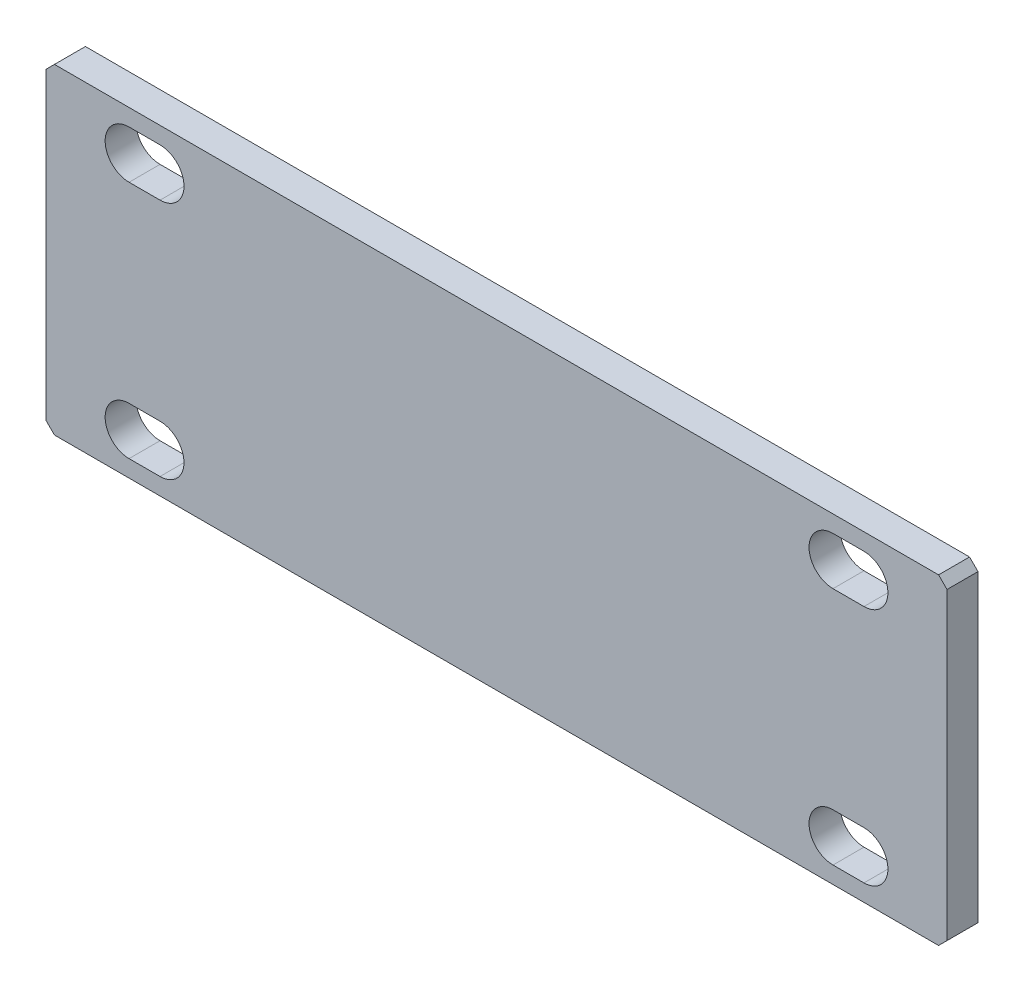
ISO-10303-21;
HEADER;
FILE_DESCRIPTION(('STEP AP214'),'2;1');
FILE_NAME('part.step','',(''),(''),'','','');
FILE_SCHEMA(('AUTOMOTIVE_DESIGN { 1 0 10303 214 1 1 1 1 }'));
ENDSEC;
DATA;
#1=APPLICATION_CONTEXT('core data for automotive mechanical design processes');
#2=APPLICATION_PROTOCOL_DEFINITION('international standard','automotive_design',2000,#1);
#3=PRODUCT_CONTEXT('',#1,'mechanical');
#4=PRODUCT('Part','Part','',(#3));
#5=PRODUCT_RELATED_PRODUCT_CATEGORY('part','',(#4));
#6=PRODUCT_DEFINITION_FORMATION('','',#4);
#7=PRODUCT_DEFINITION_CONTEXT('part definition',#1,'design');
#8=PRODUCT_DEFINITION('design','',#6,#7);
#9=PRODUCT_DEFINITION_SHAPE('','',#8);
#10=(LENGTH_UNIT() NAMED_UNIT(*) SI_UNIT(.MILLI.,.METRE.));
#11=(NAMED_UNIT(*) PLANE_ANGLE_UNIT() SI_UNIT($,.RADIAN.));
#12=(NAMED_UNIT(*) SI_UNIT($,.STERADIAN.) SOLID_ANGLE_UNIT());
#13=UNCERTAINTY_MEASURE_WITH_UNIT(LENGTH_MEASURE(1.E-05),#10,'distance_accuracy_value','');
#14=(GEOMETRIC_REPRESENTATION_CONTEXT(3) GLOBAL_UNCERTAINTY_ASSIGNED_CONTEXT((#13)) GLOBAL_UNIT_ASSIGNED_CONTEXT((#10,
#11,#12)) REPRESENTATION_CONTEXT('',''));
#15=CARTESIAN_POINT('',(0.,0.,0.));
#16=DIRECTION('',(0.,0.,1.));
#17=DIRECTION('',(1.,0.,0.));
#18=AXIS2_PLACEMENT_3D('',#15,#16,#17);
#19=CARTESIAN_POINT('',(0.,0.,2.2));
#20=DIRECTION('',(0.,0.,1.));
#21=DIRECTION('',(1.,0.,0.));
#22=AXIS2_PLACEMENT_3D('',#19,#20,#21);
#23=PLANE('',#22);
#24=DIRECTION('',(0.70710678118655,-0.707106781186546,0.));
#25=VECTOR('',#24,1.);
#26=CARTESIAN_POINT('',(-32.,-10.8,2.2));
#27=LINE('',#26,#25);
#28=CARTESIAN_POINT('',(-32.,-10.8,2.2));
#29=VERTEX_POINT('',#28);
#30=CARTESIAN_POINT('',(-31.4,-11.4,2.2));
#31=VERTEX_POINT('',#30);
#32=EDGE_CURVE('E333',#29,#31,#27,.T.);
#33=ORIENTED_EDGE('',*,*,#32,.T.);
#34=DIRECTION('',(1.,0.,0.));
#35=VECTOR('',#34,1.);
#36=CARTESIAN_POINT('',(-31.4,-11.4,2.2));
#37=LINE('',#36,#35);
#38=CARTESIAN_POINT('',(31.4,-11.4,2.2));
#39=VERTEX_POINT('',#38);
#40=EDGE_CURVE('E336',#31,#39,#37,.T.);
#41=ORIENTED_EDGE('',*,*,#40,.T.);
#42=DIRECTION('',(0.70710678118655,0.707106781186546,0.));
#43=VECTOR('',#42,1.);
#44=CARTESIAN_POINT('',(31.4,-11.4,2.2));
#45=LINE('',#44,#43);
#46=CARTESIAN_POINT('',(32.,-10.8,2.2));
#47=VERTEX_POINT('',#46);
#48=EDGE_CURVE('E339',#39,#47,#45,.T.);
#49=ORIENTED_EDGE('',*,*,#48,.T.);
#50=DIRECTION('',(0.,1.,0.));
#51=VECTOR('',#50,1.);
#52=CARTESIAN_POINT('',(32.,-10.8,2.2));
#53=LINE('',#52,#51);
#54=CARTESIAN_POINT('',(32.,10.8,2.2));
#55=VERTEX_POINT('',#54);
#56=EDGE_CURVE('E341',#47,#55,#53,.T.);
#57=ORIENTED_EDGE('',*,*,#56,.T.);
#58=DIRECTION('',(-0.70710678118655,0.707106781186546,0.));
#59=VECTOR('',#58,1.);
#60=CARTESIAN_POINT('',(32.,10.8,2.2));
#61=LINE('',#60,#59);
#62=CARTESIAN_POINT('',(31.4,11.4,2.2));
#63=VERTEX_POINT('',#62);
#64=EDGE_CURVE('E343',#55,#63,#61,.T.);
#65=ORIENTED_EDGE('',*,*,#64,.T.);
#66=DIRECTION('',(-1.,0.,0.));
#67=VECTOR('',#66,1.);
#68=CARTESIAN_POINT('',(31.4,11.4,2.2));
#69=LINE('',#68,#67);
#70=CARTESIAN_POINT('',(-31.4,11.4,2.2));
#71=VERTEX_POINT('',#70);
#72=EDGE_CURVE('E345',#63,#71,#69,.T.);
#73=ORIENTED_EDGE('',*,*,#72,.T.);
#74=DIRECTION('',(-0.70710678118655,-0.707106781186546,0.));
#75=VECTOR('',#74,1.);
#76=CARTESIAN_POINT('',(-31.4,11.4,2.2));
#77=LINE('',#76,#75);
#78=CARTESIAN_POINT('',(-32.,10.8,2.2));
#79=VERTEX_POINT('',#78);
#80=EDGE_CURVE('E347',#71,#79,#77,.T.);
#81=ORIENTED_EDGE('',*,*,#80,.T.);
#82=DIRECTION('',(0.,-1.,0.));
#83=VECTOR('',#82,1.);
#84=CARTESIAN_POINT('',(-32.,10.8,2.2));
#85=LINE('',#84,#83);
#86=EDGE_CURVE('E349',#79,#29,#85,.T.);
#87=ORIENTED_EDGE('',*,*,#86,.T.);
#88=EDGE_LOOP('',(#33,#41,#49,#57,#65,#73,#81,#87));
#89=FACE_BOUND('',#88,.T.);
#90=DIRECTION('',(1.,0.,0.));
#91=VECTOR('',#90,1.);
#92=CARTESIAN_POINT('',(-26.1,-10.2,2.2));
#93=LINE('',#92,#91);
#94=CARTESIAN_POINT('',(-26.1,-10.2,2.2));
#95=VERTEX_POINT('',#94);
#96=CARTESIAN_POINT('',(-23.9,-10.2,2.2));
#97=VERTEX_POINT('',#96);
#98=EDGE_CURVE('E304',#95,#97,#93,.T.);
#99=ORIENTED_EDGE('',*,*,#98,.F.);
#100=CARTESIAN_POINT('',(-26.1,-8.5,2.2));
#101=DIRECTION('',(0.,0.,1.));
#102=DIRECTION('',(1.,0.,0.));
#103=AXIS2_PLACEMENT_3D('',#100,#101,#102);
#104=CIRCLE('',#103,1.7);
#105=CARTESIAN_POINT('',(-26.1,-6.8,2.2));
#106=VERTEX_POINT('',#105);
#107=EDGE_CURVE('E302',#106,#95,#104,.T.);
#108=ORIENTED_EDGE('',*,*,#107,.F.);
#109=DIRECTION('',(-1.,0.,0.));
#110=VECTOR('',#109,1.);
#111=CARTESIAN_POINT('',(-23.9,-6.8,2.2));
#112=LINE('',#111,#110);
#113=CARTESIAN_POINT('',(-23.9,-6.8,2.2));
#114=VERTEX_POINT('',#113);
#115=EDGE_CURVE('E310',#114,#106,#112,.T.);
#116=ORIENTED_EDGE('',*,*,#115,.F.);
#117=CARTESIAN_POINT('',(-23.9,-8.5,2.2));
#118=DIRECTION('',(0.,0.,1.));
#119=DIRECTION('',(1.,0.,0.));
#120=AXIS2_PLACEMENT_3D('',#117,#118,#119);
#121=CIRCLE('',#120,1.7);
#122=EDGE_CURVE('E307',#97,#114,#121,.T.);
#123=ORIENTED_EDGE('',*,*,#122,.F.);
#124=EDGE_LOOP('',(#99,#108,#116,#123));
#125=FACE_BOUND('',#124,.T.);
#126=DIRECTION('',(1.,0.,0.));
#127=VECTOR('',#126,1.);
#128=CARTESIAN_POINT('',(-26.1,6.8,2.2));
#129=LINE('',#128,#127);
#130=CARTESIAN_POINT('',(-26.1,6.8,2.2));
#131=VERTEX_POINT('',#130);
#132=CARTESIAN_POINT('',(-23.9,6.8,2.2));
#133=VERTEX_POINT('',#132);
#134=EDGE_CURVE('E273',#131,#133,#129,.T.);
#135=ORIENTED_EDGE('',*,*,#134,.F.);
#136=CARTESIAN_POINT('',(-26.1,8.5,2.2));
#137=DIRECTION('',(0.,0.,1.));
#138=DIRECTION('',(1.,0.,0.));
#139=AXIS2_PLACEMENT_3D('',#136,#137,#138);
#140=CIRCLE('',#139,1.7);
#141=CARTESIAN_POINT('',(-26.1,10.2,2.2));
#142=VERTEX_POINT('',#141);
#143=EDGE_CURVE('E271',#142,#131,#140,.T.);
#144=ORIENTED_EDGE('',*,*,#143,.F.);
#145=DIRECTION('',(-1.,0.,0.));
#146=VECTOR('',#145,1.);
#147=CARTESIAN_POINT('',(-23.9,10.2,2.2));
#148=LINE('',#147,#146);
#149=CARTESIAN_POINT('',(-23.9,10.2,2.2));
#150=VERTEX_POINT('',#149);
#151=EDGE_CURVE('E279',#150,#142,#148,.T.);
#152=ORIENTED_EDGE('',*,*,#151,.F.);
#153=CARTESIAN_POINT('',(-23.9,8.5,2.2));
#154=DIRECTION('',(0.,0.,1.));
#155=DIRECTION('',(1.,0.,0.));
#156=AXIS2_PLACEMENT_3D('',#153,#154,#155);
#157=CIRCLE('',#156,1.7);
#158=EDGE_CURVE('E276',#133,#150,#157,.T.);
#159=ORIENTED_EDGE('',*,*,#158,.F.);
#160=EDGE_LOOP('',(#135,#144,#152,#159));
#161=FACE_BOUND('',#160,.T.);
#162=DIRECTION('',(1.,0.,0.));
#163=VECTOR('',#162,1.);
#164=CARTESIAN_POINT('',(23.9,-10.2,2.2));
#165=LINE('',#164,#163);
#166=CARTESIAN_POINT('',(23.9,-10.2,2.2));
#167=VERTEX_POINT('',#166);
#168=CARTESIAN_POINT('',(26.1,-10.2,2.2));
#169=VERTEX_POINT('',#168);
#170=EDGE_CURVE('E242',#167,#169,#165,.T.);
#171=ORIENTED_EDGE('',*,*,#170,.F.);
#172=CARTESIAN_POINT('',(23.9,-8.5,2.2));
#173=DIRECTION('',(0.,0.,1.));
#174=DIRECTION('',(1.,0.,0.));
#175=AXIS2_PLACEMENT_3D('',#172,#173,#174);
#176=CIRCLE('',#175,1.7);
#177=CARTESIAN_POINT('',(23.9,-6.8,2.2));
#178=VERTEX_POINT('',#177);
#179=EDGE_CURVE('E240',#178,#167,#176,.T.);
#180=ORIENTED_EDGE('',*,*,#179,.F.);
#181=DIRECTION('',(-1.,0.,0.));
#182=VECTOR('',#181,1.);
#183=CARTESIAN_POINT('',(26.1,-6.8,2.2));
#184=LINE('',#183,#182);
#185=CARTESIAN_POINT('',(26.1,-6.8,2.2));
#186=VERTEX_POINT('',#185);
#187=EDGE_CURVE('E248',#186,#178,#184,.T.);
#188=ORIENTED_EDGE('',*,*,#187,.F.);
#189=CARTESIAN_POINT('',(26.1,-8.5,2.2));
#190=DIRECTION('',(0.,0.,1.));
#191=DIRECTION('',(1.,0.,0.));
#192=AXIS2_PLACEMENT_3D('',#189,#190,#191);
#193=CIRCLE('',#192,1.7);
#194=EDGE_CURVE('E245',#169,#186,#193,.T.);
#195=ORIENTED_EDGE('',*,*,#194,.F.);
#196=EDGE_LOOP('',(#171,#180,#188,#195));
#197=FACE_BOUND('',#196,.T.);
#198=DIRECTION('',(1.,0.,0.));
#199=VECTOR('',#198,1.);
#200=CARTESIAN_POINT('',(23.9,6.8,2.2));
#201=LINE('',#200,#199);
#202=CARTESIAN_POINT('',(23.9,6.8,2.2));
#203=VERTEX_POINT('',#202);
#204=CARTESIAN_POINT('',(26.1,6.8,2.2));
#205=VERTEX_POINT('',#204);
#206=EDGE_CURVE('E212',#203,#205,#201,.T.);
#207=ORIENTED_EDGE('',*,*,#206,.F.);
#208=CARTESIAN_POINT('',(23.9,8.5,2.2));
#209=DIRECTION('',(0.,0.,1.));
#210=DIRECTION('',(1.,0.,0.));
#211=AXIS2_PLACEMENT_3D('',#208,#209,#210);
#212=CIRCLE('',#211,1.7);
#213=CARTESIAN_POINT('',(23.9,10.2,2.2));
#214=VERTEX_POINT('',#213);
#215=EDGE_CURVE('E204',#214,#203,#212,.T.);
#216=ORIENTED_EDGE('',*,*,#215,.F.);
#217=DIRECTION('',(-1.,0.,0.));
#218=VECTOR('',#217,1.);
#219=CARTESIAN_POINT('',(26.1,10.2,2.2));
#220=LINE('',#219,#218);
#221=CARTESIAN_POINT('',(26.1,10.2,2.2));
#222=VERTEX_POINT('',#221);
#223=EDGE_CURVE('E226',#222,#214,#220,.T.);
#224=ORIENTED_EDGE('',*,*,#223,.F.);
#225=CARTESIAN_POINT('',(26.1,8.5,2.2));
#226=DIRECTION('',(0.,0.,1.));
#227=DIRECTION('',(1.,0.,0.));
#228=AXIS2_PLACEMENT_3D('',#225,#226,#227);
#229=CIRCLE('',#228,1.7);
#230=EDGE_CURVE('E224',#205,#222,#229,.T.);
#231=ORIENTED_EDGE('',*,*,#230,.F.);
#232=EDGE_LOOP('',(#207,#216,#224,#231));
#233=FACE_BOUND('',#232,.T.);
#234=ADVANCED_FACE('F43',(#89,#125,#161,#197,#233),#23,.T.);
#235=CARTESIAN_POINT('',(0.,0.,0.));
#236=DIRECTION('',(0.,0.,1.));
#237=DIRECTION('',(1.,0.,0.));
#238=AXIS2_PLACEMENT_3D('',#235,#236,#237);
#239=PLANE('',#238);
#240=CARTESIAN_POINT('',(23.9,-8.5,0.));
#241=DIRECTION('',(0.,0.,1.));
#242=DIRECTION('',(1.,0.,0.));
#243=AXIS2_PLACEMENT_3D('',#240,#241,#242);
#244=CIRCLE('',#243,1.7);
#245=CARTESIAN_POINT('',(23.9,-6.8,0.));
#246=VERTEX_POINT('',#245);
#247=CARTESIAN_POINT('',(23.9,-10.2,0.));
#248=VERTEX_POINT('',#247);
#249=EDGE_CURVE('E220',#246,#248,#244,.T.);
#250=ORIENTED_EDGE('',*,*,#249,.T.);
#251=DIRECTION('',(1.,0.,0.));
#252=VECTOR('',#251,1.);
#253=CARTESIAN_POINT('',(23.9,-10.2,0.));
#254=LINE('',#253,#252);
#255=CARTESIAN_POINT('',(26.1,-10.2,0.));
#256=VERTEX_POINT('',#255);
#257=EDGE_CURVE('E253',#248,#256,#254,.T.);
#258=ORIENTED_EDGE('',*,*,#257,.T.);
#259=CARTESIAN_POINT('',(26.1,-8.5,0.));
#260=DIRECTION('',(0.,0.,1.));
#261=DIRECTION('',(1.,0.,0.));
#262=AXIS2_PLACEMENT_3D('',#259,#260,#261);
#263=CIRCLE('',#262,1.7);
#264=CARTESIAN_POINT('',(26.1,-6.8,0.));
#265=VERTEX_POINT('',#264);
#266=EDGE_CURVE('E256',#256,#265,#263,.T.);
#267=ORIENTED_EDGE('',*,*,#266,.T.);
#268=DIRECTION('',(-1.,0.,0.));
#269=VECTOR('',#268,1.);
#270=CARTESIAN_POINT('',(26.1,-6.8,0.));
#271=LINE('',#270,#269);
#272=EDGE_CURVE('E243',#265,#246,#271,.T.);
#273=ORIENTED_EDGE('',*,*,#272,.T.);
#274=EDGE_LOOP('',(#250,#258,#267,#273));
#275=FACE_BOUND('',#274,.T.);
#276=CARTESIAN_POINT('',(-26.1,-8.5,0.));
#277=DIRECTION('',(0.,0.,1.));
#278=DIRECTION('',(1.,0.,0.));
#279=AXIS2_PLACEMENT_3D('',#276,#277,#278);
#280=CIRCLE('',#279,1.7);
#281=CARTESIAN_POINT('',(-26.1,-6.8,0.));
#282=VERTEX_POINT('',#281);
#283=CARTESIAN_POINT('',(-26.1,-10.2,0.));
#284=VERTEX_POINT('',#283);
#285=EDGE_CURVE('E301',#282,#284,#280,.T.);
#286=ORIENTED_EDGE('',*,*,#285,.T.);
#287=DIRECTION('',(1.,0.,0.));
#288=VECTOR('',#287,1.);
#289=CARTESIAN_POINT('',(-26.1,-10.2,0.));
#290=LINE('',#289,#288);
#291=CARTESIAN_POINT('',(-23.9,-10.2,0.));
#292=VERTEX_POINT('',#291);
#293=EDGE_CURVE('E315',#284,#292,#290,.T.);
#294=ORIENTED_EDGE('',*,*,#293,.T.);
#295=CARTESIAN_POINT('',(-23.9,-8.5,0.));
#296=DIRECTION('',(0.,0.,1.));
#297=DIRECTION('',(1.,0.,0.));
#298=AXIS2_PLACEMENT_3D('',#295,#296,#297);
#299=CIRCLE('',#298,1.7);
#300=CARTESIAN_POINT('',(-23.9,-6.8,0.));
#301=VERTEX_POINT('',#300);
#302=EDGE_CURVE('E318',#292,#301,#299,.T.);
#303=ORIENTED_EDGE('',*,*,#302,.T.);
#304=DIRECTION('',(-1.,0.,0.));
#305=VECTOR('',#304,1.);
#306=CARTESIAN_POINT('',(-23.9,-6.8,0.));
#307=LINE('',#306,#305);
#308=EDGE_CURVE('E305',#301,#282,#307,.T.);
#309=ORIENTED_EDGE('',*,*,#308,.T.);
#310=EDGE_LOOP('',(#286,#294,#303,#309));
#311=FACE_BOUND('',#310,.T.);
#312=DIRECTION('',(0.70710678118655,-0.707106781186546,0.));
#313=VECTOR('',#312,1.);
#314=CARTESIAN_POINT('',(-32.,-10.8,0.));
#315=LINE('',#314,#313);
#316=CARTESIAN_POINT('',(-32.,-10.8,0.));
#317=VERTEX_POINT('',#316);
#318=CARTESIAN_POINT('',(-31.4,-11.4,0.));
#319=VERTEX_POINT('',#318);
#320=EDGE_CURVE('E332',#317,#319,#315,.T.);
#321=ORIENTED_EDGE('',*,*,#320,.F.);
#322=DIRECTION('',(0.,-1.,0.));
#323=VECTOR('',#322,1.);
#324=CARTESIAN_POINT('',(-32.,10.8,0.));
#325=LINE('',#324,#323);
#326=CARTESIAN_POINT('',(-32.,10.8,0.));
#327=VERTEX_POINT('',#326);
#328=EDGE_CURVE('E337',#327,#317,#325,.T.);
#329=ORIENTED_EDGE('',*,*,#328,.F.);
#330=DIRECTION('',(-0.70710678118655,-0.707106781186546,0.));
#331=VECTOR('',#330,1.);
#332=CARTESIAN_POINT('',(-31.4,11.4,0.));
#333=LINE('',#332,#331);
#334=CARTESIAN_POINT('',(-31.4,11.4,0.));
#335=VERTEX_POINT('',#334);
#336=EDGE_CURVE('E364',#335,#327,#333,.T.);
#337=ORIENTED_EDGE('',*,*,#336,.F.);
#338=DIRECTION('',(-1.,0.,0.));
#339=VECTOR('',#338,1.);
#340=CARTESIAN_POINT('',(31.4,11.4,0.));
#341=LINE('',#340,#339);
#342=CARTESIAN_POINT('',(31.4,11.4,0.));
#343=VERTEX_POINT('',#342);
#344=EDGE_CURVE('E362',#343,#335,#341,.T.);
#345=ORIENTED_EDGE('',*,*,#344,.F.);
#346=DIRECTION('',(-0.70710678118655,0.707106781186546,0.));
#347=VECTOR('',#346,1.);
#348=CARTESIAN_POINT('',(32.,10.8,0.));
#349=LINE('',#348,#347);
#350=CARTESIAN_POINT('',(32.,10.8,0.));
#351=VERTEX_POINT('',#350);
#352=EDGE_CURVE('E360',#351,#343,#349,.T.);
#353=ORIENTED_EDGE('',*,*,#352,.F.);
#354=DIRECTION('',(0.,1.,0.));
#355=VECTOR('',#354,1.);
#356=CARTESIAN_POINT('',(32.,-10.8,0.));
#357=LINE('',#356,#355);
#358=CARTESIAN_POINT('',(32.,-10.8,0.));
#359=VERTEX_POINT('',#358);
#360=EDGE_CURVE('E358',#359,#351,#357,.T.);
#361=ORIENTED_EDGE('',*,*,#360,.F.);
#362=DIRECTION('',(0.70710678118655,0.707106781186546,0.));
#363=VECTOR('',#362,1.);
#364=CARTESIAN_POINT('',(31.4,-11.4,0.));
#365=LINE('',#364,#363);
#366=CARTESIAN_POINT('',(31.4,-11.4,0.));
#367=VERTEX_POINT('',#366);
#368=EDGE_CURVE('E356',#367,#359,#365,.T.);
#369=ORIENTED_EDGE('',*,*,#368,.F.);
#370=DIRECTION('',(1.,0.,0.));
#371=VECTOR('',#370,1.);
#372=CARTESIAN_POINT('',(-31.4,-11.4,0.));
#373=LINE('',#372,#371);
#374=EDGE_CURVE('E354',#319,#367,#373,.T.);
#375=ORIENTED_EDGE('',*,*,#374,.F.);
#376=EDGE_LOOP('',(#321,#329,#337,#345,#353,#361,#369,#375));
#377=FACE_BOUND('',#376,.T.);
#378=CARTESIAN_POINT('',(-26.1,8.5,0.));
#379=DIRECTION('',(0.,0.,1.));
#380=DIRECTION('',(1.,0.,0.));
#381=AXIS2_PLACEMENT_3D('',#378,#379,#380);
#382=CIRCLE('',#381,1.7);
#383=CARTESIAN_POINT('',(-26.1,10.2,0.));
#384=VERTEX_POINT('',#383);
#385=CARTESIAN_POINT('',(-26.1,6.8,0.));
#386=VERTEX_POINT('',#385);
#387=EDGE_CURVE('E270',#384,#386,#382,.T.);
#388=ORIENTED_EDGE('',*,*,#387,.T.);
#389=DIRECTION('',(1.,0.,0.));
#390=VECTOR('',#389,1.);
#391=CARTESIAN_POINT('',(-26.1,6.8,0.));
#392=LINE('',#391,#390);
#393=CARTESIAN_POINT('',(-23.9,6.8,0.));
#394=VERTEX_POINT('',#393);
#395=EDGE_CURVE('E284',#386,#394,#392,.T.);
#396=ORIENTED_EDGE('',*,*,#395,.T.);
#397=CARTESIAN_POINT('',(-23.9,8.5,0.));
#398=DIRECTION('',(0.,0.,1.));
#399=DIRECTION('',(1.,0.,0.));
#400=AXIS2_PLACEMENT_3D('',#397,#398,#399);
#401=CIRCLE('',#400,1.7);
#402=CARTESIAN_POINT('',(-23.9,10.2,0.));
#403=VERTEX_POINT('',#402);
#404=EDGE_CURVE('E287',#394,#403,#401,.T.);
#405=ORIENTED_EDGE('',*,*,#404,.T.);
#406=DIRECTION('',(-1.,0.,0.));
#407=VECTOR('',#406,1.);
#408=CARTESIAN_POINT('',(-23.9,10.2,0.));
#409=LINE('',#408,#407);
#410=EDGE_CURVE('E274',#403,#384,#409,.T.);
#411=ORIENTED_EDGE('',*,*,#410,.T.);
#412=EDGE_LOOP('',(#388,#396,#405,#411));
#413=FACE_BOUND('',#412,.T.);
#414=CARTESIAN_POINT('',(23.9,8.5,0.));
#415=DIRECTION('',(0.,0.,1.));
#416=DIRECTION('',(1.,0.,0.));
#417=AXIS2_PLACEMENT_3D('',#414,#415,#416);
#418=CIRCLE('',#417,1.7);
#419=CARTESIAN_POINT('',(23.9,10.2,0.));
#420=VERTEX_POINT('',#419);
#421=CARTESIAN_POINT('',(23.9,6.8,0.));
#422=VERTEX_POINT('',#421);
#423=EDGE_CURVE('E66',#420,#422,#418,.T.);
#424=ORIENTED_EDGE('',*,*,#423,.T.);
#425=DIRECTION('',(1.,0.,0.));
#426=VECTOR('',#425,1.);
#427=CARTESIAN_POINT('',(23.9,6.8,0.));
#428=LINE('',#427,#426);
#429=CARTESIAN_POINT('',(26.1,6.8,0.));
#430=VERTEX_POINT('',#429);
#431=EDGE_CURVE('E219',#422,#430,#428,.T.);
#432=ORIENTED_EDGE('',*,*,#431,.T.);
#433=CARTESIAN_POINT('',(26.1,8.5,0.));
#434=DIRECTION('',(0.,0.,1.));
#435=DIRECTION('',(1.,0.,0.));
#436=AXIS2_PLACEMENT_3D('',#433,#434,#435);
#437=CIRCLE('',#436,1.7);
#438=CARTESIAN_POINT('',(26.1,10.2,0.));
#439=VERTEX_POINT('',#438);
#440=EDGE_CURVE('E232',#430,#439,#437,.T.);
#441=ORIENTED_EDGE('',*,*,#440,.T.);
#442=DIRECTION('',(-1.,0.,0.));
#443=VECTOR('',#442,1.);
#444=CARTESIAN_POINT('',(26.1,10.2,0.));
#445=LINE('',#444,#443);
#446=EDGE_CURVE('E213',#439,#420,#445,.T.);
#447=ORIENTED_EDGE('',*,*,#446,.T.);
#448=EDGE_LOOP('',(#424,#432,#441,#447));
#449=FACE_BOUND('',#448,.T.);
#450=ADVANCED_FACE('F394',(#275,#311,#377,#413,#449),#239,.F.);
#451=CARTESIAN_POINT('',(-32.,-10.8,2.2));
#452=DIRECTION('',(0.707106781186545,0.70710678118655,0.));
#453=DIRECTION('',(-0.70710678118655,0.707106781186545,0.));
#454=AXIS2_PLACEMENT_3D('',#451,#452,#453);
#455=PLANE('',#454);
#456=ORIENTED_EDGE('',*,*,#320,.T.);
#457=DIRECTION('',(0.,0.,-1.));
#458=VECTOR('',#457,1.);
#459=CARTESIAN_POINT('',(-31.4,-11.4,2.2));
#460=LINE('',#459,#458);
#461=EDGE_CURVE('E11',#31,#319,#460,.T.);
#462=ORIENTED_EDGE('',*,*,#461,.F.);
#463=ORIENTED_EDGE('',*,*,#32,.F.);
#464=DIRECTION('',(0.,0.,-1.));
#465=VECTOR('',#464,1.);
#466=CARTESIAN_POINT('',(-32.,-10.8,2.2));
#467=LINE('',#466,#465);
#468=EDGE_CURVE('E351',#29,#317,#467,.T.);
#469=ORIENTED_EDGE('',*,*,#468,.T.);
#470=EDGE_LOOP('',(#456,#462,#463,#469));
#471=FACE_BOUND('',#470,.T.);
#472=ADVANCED_FACE('F45',(#471),#455,.F.);
#473=CARTESIAN_POINT('',(-31.4,-11.4,2.2));
#474=DIRECTION('',(0.,1.,0.));
#475=DIRECTION('',(0.,0.,1.));
#476=AXIS2_PLACEMENT_3D('',#473,#474,#475);
#477=PLANE('',#476);
#478=ORIENTED_EDGE('',*,*,#374,.T.);
#479=DIRECTION('',(0.,0.,-1.));
#480=VECTOR('',#479,1.);
#481=CARTESIAN_POINT('',(31.4,-11.4,2.2));
#482=LINE('',#481,#480);
#483=EDGE_CURVE('E51',#39,#367,#482,.T.);
#484=ORIENTED_EDGE('',*,*,#483,.F.);
#485=ORIENTED_EDGE('',*,*,#40,.F.);
#486=ORIENTED_EDGE('',*,*,#461,.T.);
#487=EDGE_LOOP('',(#478,#484,#485,#486));
#488=FACE_BOUND('',#487,.T.);
#489=ADVANCED_FACE('F412',(#488),#477,.F.);
#490=CARTESIAN_POINT('',(31.4,-11.4,2.2));
#491=DIRECTION('',(-0.707106781186545,0.70710678118655,0.));
#492=DIRECTION('',(-0.70710678118655,-0.707106781186545,0.));
#493=AXIS2_PLACEMENT_3D('',#490,#491,#492);
#494=PLANE('',#493);
#495=ORIENTED_EDGE('',*,*,#368,.T.);
#496=DIRECTION('',(0.,0.,-1.));
#497=VECTOR('',#496,1.);
#498=CARTESIAN_POINT('',(32.,-10.8,2.2));
#499=LINE('',#498,#497);
#500=EDGE_CURVE('E381',#47,#359,#499,.T.);
#501=ORIENTED_EDGE('',*,*,#500,.F.);
#502=ORIENTED_EDGE('',*,*,#48,.F.);
#503=ORIENTED_EDGE('',*,*,#483,.T.);
#504=EDGE_LOOP('',(#495,#501,#502,#503));
#505=FACE_BOUND('',#504,.T.);
#506=ADVANCED_FACE('F388',(#505),#494,.F.);
#507=CARTESIAN_POINT('',(32.,-10.8,2.2));
#508=DIRECTION('',(-1.,0.,0.));
#509=DIRECTION('',(0.,0.,1.));
#510=AXIS2_PLACEMENT_3D('',#507,#508,#509);
#511=PLANE('',#510);
#512=ORIENTED_EDGE('',*,*,#360,.T.);
#513=DIRECTION('',(0.,0.,-1.));
#514=VECTOR('',#513,1.);
#515=CARTESIAN_POINT('',(32.,10.8,2.2));
#516=LINE('',#515,#514);
#517=EDGE_CURVE('E378',#55,#351,#516,.T.);
#518=ORIENTED_EDGE('',*,*,#517,.F.);
#519=ORIENTED_EDGE('',*,*,#56,.F.);
#520=ORIENTED_EDGE('',*,*,#500,.T.);
#521=EDGE_LOOP('',(#512,#518,#519,#520));
#522=FACE_BOUND('',#521,.T.);
#523=ADVANCED_FACE('F400',(#522),#511,.F.);
#524=CARTESIAN_POINT('',(32.,10.8,2.2));
#525=DIRECTION('',(-0.707106781186545,-0.70710678118655,0.));
#526=DIRECTION('',(0.70710678118655,-0.707106781186545,0.));
#527=AXIS2_PLACEMENT_3D('',#524,#525,#526);
#528=PLANE('',#527);
#529=ORIENTED_EDGE('',*,*,#352,.T.);
#530=DIRECTION('',(0.,0.,-1.));
#531=VECTOR('',#530,1.);
#532=CARTESIAN_POINT('',(31.4,11.4,2.2));
#533=LINE('',#532,#531);
#534=EDGE_CURVE('E375',#63,#343,#533,.T.);
#535=ORIENTED_EDGE('',*,*,#534,.F.);
#536=ORIENTED_EDGE('',*,*,#64,.F.);
#537=ORIENTED_EDGE('',*,*,#517,.T.);
#538=EDGE_LOOP('',(#529,#535,#536,#537));
#539=FACE_BOUND('',#538,.T.);
#540=ADVANCED_FACE('F404',(#539),#528,.F.);
#541=CARTESIAN_POINT('',(31.4,11.4,2.2));
#542=DIRECTION('',(0.,-1.,0.));
#543=DIRECTION('',(0.,0.,-1.));
#544=AXIS2_PLACEMENT_3D('',#541,#542,#543);
#545=PLANE('',#544);
#546=ORIENTED_EDGE('',*,*,#344,.T.);
#547=DIRECTION('',(0.,0.,-1.));
#548=VECTOR('',#547,1.);
#549=CARTESIAN_POINT('',(-31.4,11.4,2.2));
#550=LINE('',#549,#548);
#551=EDGE_CURVE('E372',#71,#335,#550,.T.);
#552=ORIENTED_EDGE('',*,*,#551,.F.);
#553=ORIENTED_EDGE('',*,*,#72,.F.);
#554=ORIENTED_EDGE('',*,*,#534,.T.);
#555=EDGE_LOOP('',(#546,#552,#553,#554));
#556=FACE_BOUND('',#555,.T.);
#557=ADVANCED_FACE('F425',(#556),#545,.F.);
#558=CARTESIAN_POINT('',(-31.4,11.4,2.2));
#559=DIRECTION('',(0.707106781186545,-0.70710678118655,0.));
#560=DIRECTION('',(0.70710678118655,0.707106781186545,0.));
#561=AXIS2_PLACEMENT_3D('',#558,#559,#560);
#562=PLANE('',#561);
#563=ORIENTED_EDGE('',*,*,#336,.T.);
#564=DIRECTION('',(0.,0.,-1.));
#565=VECTOR('',#564,1.);
#566=CARTESIAN_POINT('',(-32.,10.8,2.2));
#567=LINE('',#566,#565);
#568=EDGE_CURVE('E369',#79,#327,#567,.T.);
#569=ORIENTED_EDGE('',*,*,#568,.F.);
#570=ORIENTED_EDGE('',*,*,#80,.F.);
#571=ORIENTED_EDGE('',*,*,#551,.T.);
#572=EDGE_LOOP('',(#563,#569,#570,#571));
#573=FACE_BOUND('',#572,.T.);
#574=ADVANCED_FACE('F423',(#573),#562,.F.);
#575=CARTESIAN_POINT('',(-32.,10.8,2.2));
#576=DIRECTION('',(1.,0.,0.));
#577=DIRECTION('',(0.,0.,-1.));
#578=AXIS2_PLACEMENT_3D('',#575,#576,#577);
#579=PLANE('',#578);
#580=ORIENTED_EDGE('',*,*,#328,.T.);
#581=ORIENTED_EDGE('',*,*,#468,.F.);
#582=ORIENTED_EDGE('',*,*,#86,.F.);
#583=ORIENTED_EDGE('',*,*,#568,.T.);
#584=EDGE_LOOP('',(#580,#581,#582,#583));
#585=FACE_BOUND('',#584,.T.);
#586=ADVANCED_FACE('F418',(#585),#579,.F.);
#587=CARTESIAN_POINT('',(-26.1,-8.5,2.2));
#588=DIRECTION('',(0.,0.,-1.));
#589=DIRECTION('',(-1.,0.,0.));
#590=AXIS2_PLACEMENT_3D('',#587,#588,#589);
#591=CYLINDRICAL_SURFACE('',#590,1.7);
#592=ORIENTED_EDGE('',*,*,#285,.F.);
#593=DIRECTION('',(0.,0.,-1.));
#594=VECTOR('',#593,1.);
#595=CARTESIAN_POINT('',(-26.1,-6.8,2.2));
#596=LINE('',#595,#594);
#597=EDGE_CURVE('E312',#106,#282,#596,.T.);
#598=ORIENTED_EDGE('',*,*,#597,.F.);
#599=ORIENTED_EDGE('',*,*,#107,.T.);
#600=DIRECTION('',(0.,0.,-1.));
#601=VECTOR('',#600,1.);
#602=CARTESIAN_POINT('',(-26.1,-10.2,2.2));
#603=LINE('',#602,#601);
#604=EDGE_CURVE('E329',#95,#284,#603,.T.);
#605=ORIENTED_EDGE('',*,*,#604,.T.);
#606=EDGE_LOOP('',(#592,#598,#599,#605));
#607=FACE_BOUND('',#606,.T.);
#608=ADVANCED_FACE('F442',(#607),#591,.F.);
#609=CARTESIAN_POINT('',(-26.1,-10.2,2.2));
#610=DIRECTION('',(0.,1.,0.));
#611=DIRECTION('',(0.,0.,1.));
#612=AXIS2_PLACEMENT_3D('',#609,#610,#611);
#613=PLANE('',#612);
#614=ORIENTED_EDGE('',*,*,#293,.F.);
#615=ORIENTED_EDGE('',*,*,#604,.F.);
#616=ORIENTED_EDGE('',*,*,#98,.T.);
#617=DIRECTION('',(0.,0.,-1.));
#618=VECTOR('',#617,1.);
#619=CARTESIAN_POINT('',(-23.9,-10.2,2.2));
#620=LINE('',#619,#618);
#621=EDGE_CURVE('E327',#97,#292,#620,.T.);
#622=ORIENTED_EDGE('',*,*,#621,.T.);
#623=EDGE_LOOP('',(#614,#615,#616,#622));
#624=FACE_BOUND('',#623,.T.);
#625=ADVANCED_FACE('F449',(#624),#613,.T.);
#626=CARTESIAN_POINT('',(-23.9,-8.5,2.2));
#627=DIRECTION('',(0.,0.,-1.));
#628=DIRECTION('',(-1.,0.,0.));
#629=AXIS2_PLACEMENT_3D('',#626,#627,#628);
#630=CYLINDRICAL_SURFACE('',#629,1.7);
#631=ORIENTED_EDGE('',*,*,#302,.F.);
#632=ORIENTED_EDGE('',*,*,#621,.F.);
#633=ORIENTED_EDGE('',*,*,#122,.T.);
#634=DIRECTION('',(0.,0.,-1.));
#635=VECTOR('',#634,1.);
#636=CARTESIAN_POINT('',(-23.9,-6.8,2.2));
#637=LINE('',#636,#635);
#638=EDGE_CURVE('E325',#114,#301,#637,.T.);
#639=ORIENTED_EDGE('',*,*,#638,.T.);
#640=EDGE_LOOP('',(#631,#632,#633,#639));
#641=FACE_BOUND('',#640,.T.);
#642=ADVANCED_FACE('F454',(#641),#630,.F.);
#643=CARTESIAN_POINT('',(-23.9,-6.8,2.2));
#644=DIRECTION('',(0.,-1.,0.));
#645=DIRECTION('',(0.,0.,-1.));
#646=AXIS2_PLACEMENT_3D('',#643,#644,#645);
#647=PLANE('',#646);
#648=ORIENTED_EDGE('',*,*,#308,.F.);
#649=ORIENTED_EDGE('',*,*,#638,.F.);
#650=ORIENTED_EDGE('',*,*,#115,.T.);
#651=ORIENTED_EDGE('',*,*,#597,.T.);
#652=EDGE_LOOP('',(#648,#649,#650,#651));
#653=FACE_BOUND('',#652,.T.);
#654=ADVANCED_FACE('F462',(#653),#647,.T.);
#655=CARTESIAN_POINT('',(-26.1,8.5,2.2));
#656=DIRECTION('',(0.,0.,-1.));
#657=DIRECTION('',(-1.,0.,0.));
#658=AXIS2_PLACEMENT_3D('',#655,#656,#657);
#659=CYLINDRICAL_SURFACE('',#658,1.7);
#660=ORIENTED_EDGE('',*,*,#387,.F.);
#661=DIRECTION('',(0.,0.,-1.));
#662=VECTOR('',#661,1.);
#663=CARTESIAN_POINT('',(-26.1,10.2,2.2));
#664=LINE('',#663,#662);
#665=EDGE_CURVE('E281',#142,#384,#664,.T.);
#666=ORIENTED_EDGE('',*,*,#665,.F.);
#667=ORIENTED_EDGE('',*,*,#143,.T.);
#668=DIRECTION('',(0.,0.,-1.));
#669=VECTOR('',#668,1.);
#670=CARTESIAN_POINT('',(-26.1,6.8,2.2));
#671=LINE('',#670,#669);
#672=EDGE_CURVE('E298',#131,#386,#671,.T.);
#673=ORIENTED_EDGE('',*,*,#672,.T.);
#674=EDGE_LOOP('',(#660,#666,#667,#673));
#675=FACE_BOUND('',#674,.T.);
#676=ADVANCED_FACE('F516',(#675),#659,.F.);
#677=CARTESIAN_POINT('',(-26.1,6.8,2.2));
#678=DIRECTION('',(0.,1.,0.));
#679=DIRECTION('',(0.,0.,1.));
#680=AXIS2_PLACEMENT_3D('',#677,#678,#679);
#681=PLANE('',#680);
#682=ORIENTED_EDGE('',*,*,#395,.F.);
#683=ORIENTED_EDGE('',*,*,#672,.F.);
#684=ORIENTED_EDGE('',*,*,#134,.T.);
#685=DIRECTION('',(0.,0.,-1.));
#686=VECTOR('',#685,1.);
#687=CARTESIAN_POINT('',(-23.9,6.8,2.2));
#688=LINE('',#687,#686);
#689=EDGE_CURVE('E296',#133,#394,#688,.T.);
#690=ORIENTED_EDGE('',*,*,#689,.T.);
#691=EDGE_LOOP('',(#682,#683,#684,#690));
#692=FACE_BOUND('',#691,.T.);
#693=ADVANCED_FACE('F512',(#692),#681,.T.);
#694=CARTESIAN_POINT('',(-23.9,8.5,2.2));
#695=DIRECTION('',(0.,0.,-1.));
#696=DIRECTION('',(-1.,0.,0.));
#697=AXIS2_PLACEMENT_3D('',#694,#695,#696);
#698=CYLINDRICAL_SURFACE('',#697,1.7);
#699=ORIENTED_EDGE('',*,*,#404,.F.);
#700=ORIENTED_EDGE('',*,*,#689,.F.);
#701=ORIENTED_EDGE('',*,*,#158,.T.);
#702=DIRECTION('',(0.,0.,-1.));
#703=VECTOR('',#702,1.);
#704=CARTESIAN_POINT('',(-23.9,10.2,2.2));
#705=LINE('',#704,#703);
#706=EDGE_CURVE('E294',#150,#403,#705,.T.);
#707=ORIENTED_EDGE('',*,*,#706,.T.);
#708=EDGE_LOOP('',(#699,#700,#701,#707));
#709=FACE_BOUND('',#708,.T.);
#710=ADVANCED_FACE('F508',(#709),#698,.F.);
#711=CARTESIAN_POINT('',(-23.9,10.2,2.2));
#712=DIRECTION('',(0.,-1.,0.));
#713=DIRECTION('',(0.,0.,-1.));
#714=AXIS2_PLACEMENT_3D('',#711,#712,#713);
#715=PLANE('',#714);
#716=ORIENTED_EDGE('',*,*,#410,.F.);
#717=ORIENTED_EDGE('',*,*,#706,.F.);
#718=ORIENTED_EDGE('',*,*,#151,.T.);
#719=ORIENTED_EDGE('',*,*,#665,.T.);
#720=EDGE_LOOP('',(#716,#717,#718,#719));
#721=FACE_BOUND('',#720,.T.);
#722=ADVANCED_FACE('F505',(#721),#715,.T.);
#723=CARTESIAN_POINT('',(23.9,-8.5,2.2));
#724=DIRECTION('',(0.,0.,-1.));
#725=DIRECTION('',(-1.,0.,0.));
#726=AXIS2_PLACEMENT_3D('',#723,#724,#725);
#727=CYLINDRICAL_SURFACE('',#726,1.7);
#728=ORIENTED_EDGE('',*,*,#249,.F.);
#729=DIRECTION('',(0.,0.,-1.));
#730=VECTOR('',#729,1.);
#731=CARTESIAN_POINT('',(23.9,-6.8,2.2));
#732=LINE('',#731,#730);
#733=EDGE_CURVE('E250',#178,#246,#732,.T.);
#734=ORIENTED_EDGE('',*,*,#733,.F.);
#735=ORIENTED_EDGE('',*,*,#179,.T.);
#736=DIRECTION('',(0.,0.,-1.));
#737=VECTOR('',#736,1.);
#738=CARTESIAN_POINT('',(23.9,-10.2,2.2));
#739=LINE('',#738,#737);
#740=EDGE_CURVE('E267',#167,#248,#739,.T.);
#741=ORIENTED_EDGE('',*,*,#740,.T.);
#742=EDGE_LOOP('',(#728,#734,#735,#741));
#743=FACE_BOUND('',#742,.T.);
#744=ADVANCED_FACE('F487',(#743),#727,.F.);
#745=CARTESIAN_POINT('',(23.9,-10.2,2.2));
#746=DIRECTION('',(0.,1.,0.));
#747=DIRECTION('',(0.,0.,1.));
#748=AXIS2_PLACEMENT_3D('',#745,#746,#747);
#749=PLANE('',#748);
#750=ORIENTED_EDGE('',*,*,#257,.F.);
#751=ORIENTED_EDGE('',*,*,#740,.F.);
#752=ORIENTED_EDGE('',*,*,#170,.T.);
#753=DIRECTION('',(0.,0.,-1.));
#754=VECTOR('',#753,1.);
#755=CARTESIAN_POINT('',(26.1,-10.2,2.2));
#756=LINE('',#755,#754);
#757=EDGE_CURVE('E265',#169,#256,#756,.T.);
#758=ORIENTED_EDGE('',*,*,#757,.T.);
#759=EDGE_LOOP('',(#750,#751,#752,#758));
#760=FACE_BOUND('',#759,.T.);
#761=ADVANCED_FACE('F481',(#760),#749,.T.);
#762=CARTESIAN_POINT('',(26.1,-8.5,2.2));
#763=DIRECTION('',(0.,0.,-1.));
#764=DIRECTION('',(-1.,0.,0.));
#765=AXIS2_PLACEMENT_3D('',#762,#763,#764);
#766=CYLINDRICAL_SURFACE('',#765,1.7);
#767=ORIENTED_EDGE('',*,*,#266,.F.);
#768=ORIENTED_EDGE('',*,*,#757,.F.);
#769=ORIENTED_EDGE('',*,*,#194,.T.);
#770=DIRECTION('',(0.,0.,-1.));
#771=VECTOR('',#770,1.);
#772=CARTESIAN_POINT('',(26.1,-6.8,2.2));
#773=LINE('',#772,#771);
#774=EDGE_CURVE('E263',#186,#265,#773,.T.);
#775=ORIENTED_EDGE('',*,*,#774,.T.);
#776=EDGE_LOOP('',(#767,#768,#769,#775));
#777=FACE_BOUND('',#776,.T.);
#778=ADVANCED_FACE('F484',(#777),#766,.F.);
#779=CARTESIAN_POINT('',(26.1,-6.8,2.2));
#780=DIRECTION('',(0.,-1.,0.));
#781=DIRECTION('',(0.,0.,-1.));
#782=AXIS2_PLACEMENT_3D('',#779,#780,#781);
#783=PLANE('',#782);
#784=ORIENTED_EDGE('',*,*,#272,.F.);
#785=ORIENTED_EDGE('',*,*,#774,.F.);
#786=ORIENTED_EDGE('',*,*,#187,.T.);
#787=ORIENTED_EDGE('',*,*,#733,.T.);
#788=EDGE_LOOP('',(#784,#785,#786,#787));
#789=FACE_BOUND('',#788,.T.);
#790=ADVANCED_FACE('F490',(#789),#783,.T.);
#791=CARTESIAN_POINT('',(23.9,8.5,2.2));
#792=DIRECTION('',(0.,0.,-1.));
#793=DIRECTION('',(-1.,0.,0.));
#794=AXIS2_PLACEMENT_3D('',#791,#792,#793);
#795=CYLINDRICAL_SURFACE('',#794,1.7);
#796=ORIENTED_EDGE('',*,*,#423,.F.);
#797=DIRECTION('',(0.,0.,-1.));
#798=VECTOR('',#797,1.);
#799=CARTESIAN_POINT('',(23.9,10.2,2.2));
#800=LINE('',#799,#798);
#801=EDGE_CURVE('E208',#214,#420,#800,.T.);
#802=ORIENTED_EDGE('',*,*,#801,.F.);
#803=ORIENTED_EDGE('',*,*,#215,.T.);
#804=DIRECTION('',(0.,0.,-1.));
#805=VECTOR('',#804,1.);
#806=CARTESIAN_POINT('',(23.9,6.8,2.2));
#807=LINE('',#806,#805);
#808=EDGE_CURVE('E207',#203,#422,#807,.T.);
#809=ORIENTED_EDGE('',*,*,#808,.T.);
#810=EDGE_LOOP('',(#796,#802,#803,#809));
#811=FACE_BOUND('',#810,.T.);
#812=ADVANCED_FACE('F206',(#811),#795,.F.);
#813=CARTESIAN_POINT('',(23.9,6.8,2.2));
#814=DIRECTION('',(0.,1.,0.));
#815=DIRECTION('',(0.,0.,1.));
#816=AXIS2_PLACEMENT_3D('',#813,#814,#815);
#817=PLANE('',#816);
#818=ORIENTED_EDGE('',*,*,#431,.F.);
#819=ORIENTED_EDGE('',*,*,#808,.F.);
#820=ORIENTED_EDGE('',*,*,#206,.T.);
#821=DIRECTION('',(0.,0.,-1.));
#822=VECTOR('',#821,1.);
#823=CARTESIAN_POINT('',(26.1,6.8,2.2));
#824=LINE('',#823,#822);
#825=EDGE_CURVE('E221',#205,#430,#824,.T.);
#826=ORIENTED_EDGE('',*,*,#825,.T.);
#827=EDGE_LOOP('',(#818,#819,#820,#826));
#828=FACE_BOUND('',#827,.T.);
#829=ADVANCED_FACE('F216',(#828),#817,.T.);
#830=CARTESIAN_POINT('',(26.1,8.5,2.2));
#831=DIRECTION('',(0.,0.,-1.));
#832=DIRECTION('',(-1.,0.,0.));
#833=AXIS2_PLACEMENT_3D('',#830,#831,#832);
#834=CYLINDRICAL_SURFACE('',#833,1.7);
#835=ORIENTED_EDGE('',*,*,#440,.F.);
#836=ORIENTED_EDGE('',*,*,#825,.F.);
#837=ORIENTED_EDGE('',*,*,#230,.T.);
#838=DIRECTION('',(0.,0.,-1.));
#839=VECTOR('',#838,1.);
#840=CARTESIAN_POINT('',(26.1,10.2,2.2));
#841=LINE('',#840,#839);
#842=EDGE_CURVE('E58',#222,#439,#841,.T.);
#843=ORIENTED_EDGE('',*,*,#842,.T.);
#844=EDGE_LOOP('',(#835,#836,#837,#843));
#845=FACE_BOUND('',#844,.T.);
#846=ADVANCED_FACE('F588',(#845),#834,.F.);
#847=CARTESIAN_POINT('',(26.1,10.2,2.2));
#848=DIRECTION('',(0.,-1.,0.));
#849=DIRECTION('',(0.,0.,-1.));
#850=AXIS2_PLACEMENT_3D('',#847,#848,#849);
#851=PLANE('',#850);
#852=ORIENTED_EDGE('',*,*,#446,.F.);
#853=ORIENTED_EDGE('',*,*,#842,.F.);
#854=ORIENTED_EDGE('',*,*,#223,.T.);
#855=ORIENTED_EDGE('',*,*,#801,.T.);
#856=EDGE_LOOP('',(#852,#853,#854,#855));
#857=FACE_BOUND('',#856,.T.);
#858=ADVANCED_FACE('F596',(#857),#851,.T.);
#859=CLOSED_SHELL('',(#234,#450,#472,#489,#506,#523,#540,#557,#574,#586,#608,#625,#642,#654,
#676,#693,#710,#722,#744,#761,#778,#790,#812,#829,#846,#858));
#860=MANIFOLD_SOLID_BREP('B2',#859);
#861=ADVANCED_BREP_SHAPE_REPRESENTATION('',(#18,#860),#14);
#862=SHAPE_DEFINITION_REPRESENTATION(#9,#861);
ENDSEC;
END-ISO-10303-21;
